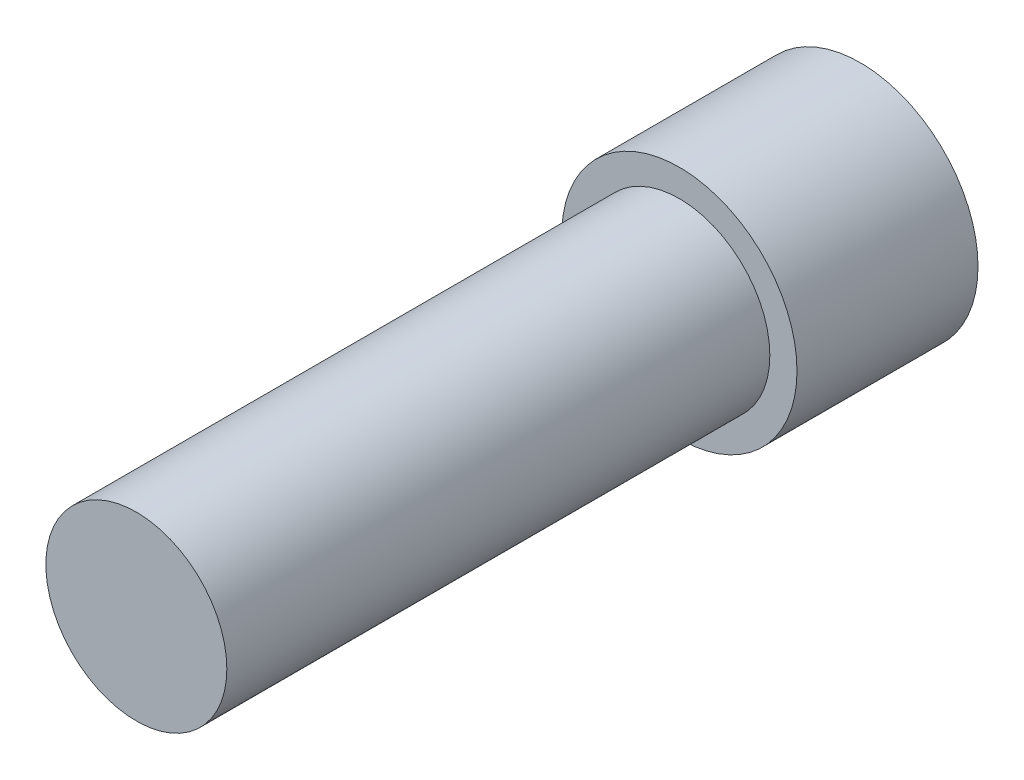
ISO-10303-21;
HEADER;
FILE_DESCRIPTION(('STEP AP214'),'2;1');
FILE_NAME('part.step','',(''),(''),'','','');
FILE_SCHEMA(('AUTOMOTIVE_DESIGN { 1 0 10303 214 1 1 1 1 }'));
ENDSEC;
DATA;
#1=APPLICATION_CONTEXT('core data for automotive mechanical design processes');
#2=APPLICATION_PROTOCOL_DEFINITION('international standard','automotive_design',2000,#1);
#3=PRODUCT_CONTEXT('',#1,'mechanical');
#4=PRODUCT('Part','Part','',(#3));
#5=PRODUCT_RELATED_PRODUCT_CATEGORY('part','',(#4));
#6=PRODUCT_DEFINITION_FORMATION('','',#4);
#7=PRODUCT_DEFINITION_CONTEXT('part definition',#1,'design');
#8=PRODUCT_DEFINITION('design','',#6,#7);
#9=PRODUCT_DEFINITION_SHAPE('','',#8);
#10=(LENGTH_UNIT() NAMED_UNIT(*) SI_UNIT(.MILLI.,.METRE.));
#11=(NAMED_UNIT(*) PLANE_ANGLE_UNIT() SI_UNIT($,.RADIAN.));
#12=(NAMED_UNIT(*) SI_UNIT($,.STERADIAN.) SOLID_ANGLE_UNIT());
#13=UNCERTAINTY_MEASURE_WITH_UNIT(LENGTH_MEASURE(1.E-05),#10,'distance_accuracy_value','');
#14=(GEOMETRIC_REPRESENTATION_CONTEXT(3) GLOBAL_UNCERTAINTY_ASSIGNED_CONTEXT((#13)) GLOBAL_UNIT_ASSIGNED_CONTEXT((#10,
#11,#12)) REPRESENTATION_CONTEXT('',''));
#15=CARTESIAN_POINT('',(0.,0.,0.));
#16=DIRECTION('',(0.,0.,1.));
#17=DIRECTION('',(1.,0.,0.));
#18=AXIS2_PLACEMENT_3D('',#15,#16,#17);
#19=CARTESIAN_POINT('',(0.,0.,10.));
#20=DIRECTION('',(0.,0.,-1.));
#21=DIRECTION('',(-1.,0.,0.));
#22=AXIS2_PLACEMENT_3D('',#19,#20,#21);
#23=CYLINDRICAL_SURFACE('',#22,6.5);
#24=CARTESIAN_POINT('',(0.,0.,10.));
#25=DIRECTION('',(0.,0.,1.));
#26=DIRECTION('',(1.,0.,0.));
#27=AXIS2_PLACEMENT_3D('',#24,#25,#26);
#28=CIRCLE('',#27,6.5);
#29=CARTESIAN_POINT('',(6.5,0.,10.));
#30=VERTEX_POINT('',#29);
#31=EDGE_CURVE('E54',#30,#30,#28,.T.);
#32=ORIENTED_EDGE('',*,*,#31,.F.);
#33=EDGE_LOOP('',(#32));
#34=FACE_BOUND('',#33,.T.);
#35=CARTESIAN_POINT('',(0.,0.,0.));
#36=DIRECTION('',(0.,0.,1.));
#37=DIRECTION('',(1.,0.,0.));
#38=AXIS2_PLACEMENT_3D('',#35,#36,#37);
#39=CIRCLE('',#38,6.5);
#40=CARTESIAN_POINT('',(6.5,0.,0.));
#41=VERTEX_POINT('',#40);
#42=EDGE_CURVE('E48',#41,#41,#39,.T.);
#43=ORIENTED_EDGE('',*,*,#42,.T.);
#44=EDGE_LOOP('',(#43));
#45=FACE_BOUND('',#44,.T.);
#46=ADVANCED_FACE('F45',(#34,#45),#23,.T.);
#47=CARTESIAN_POINT('',(0.,0.,10.));
#48=DIRECTION('',(0.,0.,1.));
#49=DIRECTION('',(1.,0.,0.));
#50=AXIS2_PLACEMENT_3D('',#47,#48,#49);
#51=PLANE('',#50);
#52=CARTESIAN_POINT('',(0.,0.,10.));
#53=DIRECTION('',(0.,0.,1.));
#54=DIRECTION('',(1.,0.,0.));
#55=AXIS2_PLACEMENT_3D('',#52,#53,#54);
#56=CIRCLE('',#55,5.);
#57=CARTESIAN_POINT('',(5.,0.,10.));
#58=VERTEX_POINT('',#57);
#59=EDGE_CURVE('E11',#58,#58,#56,.T.);
#60=ORIENTED_EDGE('',*,*,#59,.F.);
#61=EDGE_LOOP('',(#60));
#62=FACE_BOUND('',#61,.T.);
#63=ORIENTED_EDGE('',*,*,#31,.T.);
#64=EDGE_LOOP('',(#63));
#65=FACE_BOUND('',#64,.T.);
#66=ADVANCED_FACE('F185',(#62,#65),#51,.T.);
#67=CARTESIAN_POINT('',(0.,0.,0.));
#68=DIRECTION('',(0.,0.,1.));
#69=DIRECTION('',(1.,0.,0.));
#70=AXIS2_PLACEMENT_3D('',#67,#68,#69);
#71=PLANE('',#70);
#72=DIRECTION('',(0.866025403784439,0.5,0.));
#73=VECTOR('',#72,1.);
#74=CARTESIAN_POINT('',(-4.5,2.59807621135332,0.));
#75=LINE('',#74,#73);
#76=CARTESIAN_POINT('',(-4.5,2.59807621135332,0.));
#77=VERTEX_POINT('',#76);
#78=CARTESIAN_POINT('',(0.,5.19615242270663,0.));
#79=VERTEX_POINT('',#78);
#80=EDGE_CURVE('E142',#77,#79,#75,.T.);
#81=ORIENTED_EDGE('',*,*,#80,.F.);
#82=DIRECTION('',(0.,1.,0.));
#83=VECTOR('',#82,1.);
#84=CARTESIAN_POINT('',(-4.5,-2.59807621135332,0.));
#85=LINE('',#84,#83);
#86=CARTESIAN_POINT('',(-4.5,-2.59807621135332,0.));
#87=VERTEX_POINT('',#86);
#88=EDGE_CURVE('E62',#87,#77,#85,.T.);
#89=ORIENTED_EDGE('',*,*,#88,.F.);
#90=DIRECTION('',(-0.866025403784439,0.5,0.));
#91=VECTOR('',#90,1.);
#92=CARTESIAN_POINT('',(0.,-5.19615242270663,0.));
#93=LINE('',#92,#91);
#94=CARTESIAN_POINT('',(0.,-5.19615242270663,0.));
#95=VERTEX_POINT('',#94);
#96=EDGE_CURVE('E155',#95,#87,#93,.T.);
#97=ORIENTED_EDGE('',*,*,#96,.F.);
#98=DIRECTION('',(-0.866025403784438,-0.5,0.));
#99=VECTOR('',#98,1.);
#100=CARTESIAN_POINT('',(4.5,-2.59807621135331,0.));
#101=LINE('',#100,#99);
#102=CARTESIAN_POINT('',(4.5,-2.59807621135331,0.));
#103=VERTEX_POINT('',#102);
#104=EDGE_CURVE('E152',#103,#95,#101,.T.);
#105=ORIENTED_EDGE('',*,*,#104,.F.);
#106=DIRECTION('',(0.,-1.,0.));
#107=VECTOR('',#106,1.);
#108=CARTESIAN_POINT('',(4.5,2.59807621135332,0.));
#109=LINE('',#108,#107);
#110=CARTESIAN_POINT('',(4.5,2.59807621135332,0.));
#111=VERTEX_POINT('',#110);
#112=EDGE_CURVE('E110',#111,#103,#109,.T.);
#113=ORIENTED_EDGE('',*,*,#112,.F.);
#114=DIRECTION('',(0.866025403784439,-0.5,0.));
#115=VECTOR('',#114,1.);
#116=CARTESIAN_POINT('',(0.,5.19615242270663,0.));
#117=LINE('',#116,#115);
#118=EDGE_CURVE('E146',#79,#111,#117,.T.);
#119=ORIENTED_EDGE('',*,*,#118,.F.);
#120=EDGE_LOOP('',(#81,#89,#97,#105,#113,#119));
#121=FACE_BOUND('',#120,.T.);
#122=ORIENTED_EDGE('',*,*,#42,.F.);
#123=EDGE_LOOP('',(#122));
#124=FACE_BOUND('',#123,.T.);
#125=ADVANCED_FACE('F182',(#121,#124),#71,.F.);
#126=CARTESIAN_POINT('',(0.,0.,40.));
#127=DIRECTION('',(0.,0.,-1.));
#128=DIRECTION('',(-1.,0.,0.));
#129=AXIS2_PLACEMENT_3D('',#126,#127,#128);
#130=CYLINDRICAL_SURFACE('',#129,5.);
#131=CARTESIAN_POINT('',(0.,0.,40.));
#132=DIRECTION('',(0.,0.,1.));
#133=DIRECTION('',(1.,0.,0.));
#134=AXIS2_PLACEMENT_3D('',#131,#132,#133);
#135=CIRCLE('',#134,5.);
#136=CARTESIAN_POINT('',(5.,0.,40.));
#137=VERTEX_POINT('',#136);
#138=EDGE_CURVE('E161',#137,#137,#135,.T.);
#139=ORIENTED_EDGE('',*,*,#138,.F.);
#140=EDGE_LOOP('',(#139));
#141=FACE_BOUND('',#140,.T.);
#142=ORIENTED_EDGE('',*,*,#59,.T.);
#143=EDGE_LOOP('',(#142));
#144=FACE_BOUND('',#143,.T.);
#145=ADVANCED_FACE('F184',(#141,#144),#130,.T.);
#146=CARTESIAN_POINT('',(0.,0.,40.));
#147=DIRECTION('',(0.,0.,1.));
#148=DIRECTION('',(1.,0.,0.));
#149=AXIS2_PLACEMENT_3D('',#146,#147,#148);
#150=PLANE('',#149);
#151=ORIENTED_EDGE('',*,*,#138,.T.);
#152=EDGE_LOOP('',(#151));
#153=FACE_BOUND('',#152,.T.);
#154=ADVANCED_FACE('F192',(#153),#150,.T.);
#155=CARTESIAN_POINT('',(-4.5,-2.59807621135332,5.));
#156=DIRECTION('',(-1.,0.,0.));
#157=DIRECTION('',(0.,0.,1.));
#158=AXIS2_PLACEMENT_3D('',#155,#156,#157);
#159=PLANE('',#158);
#160=ORIENTED_EDGE('',*,*,#88,.T.);
#161=DIRECTION('',(0.,0.,-1.));
#162=VECTOR('',#161,1.);
#163=CARTESIAN_POINT('',(-4.5,2.59807621135332,5.));
#164=LINE('',#163,#162);
#165=CARTESIAN_POINT('',(-4.5,2.59807621135332,5.));
#166=VERTEX_POINT('',#165);
#167=EDGE_CURVE('E92',#166,#77,#164,.T.);
#168=ORIENTED_EDGE('',*,*,#167,.F.);
#169=DIRECTION('',(0.,1.,0.));
#170=VECTOR('',#169,1.);
#171=CARTESIAN_POINT('',(-4.5,-2.59807621135332,5.));
#172=LINE('',#171,#170);
#173=CARTESIAN_POINT('',(-4.5,-2.59807621135332,5.));
#174=VERTEX_POINT('',#173);
#175=EDGE_CURVE('E158',#174,#166,#172,.T.);
#176=ORIENTED_EDGE('',*,*,#175,.F.);
#177=DIRECTION('',(0.,0.,-1.));
#178=VECTOR('',#177,1.);
#179=CARTESIAN_POINT('',(-4.5,-2.59807621135332,5.));
#180=LINE('',#179,#178);
#181=EDGE_CURVE('E70',#174,#87,#180,.T.);
#182=ORIENTED_EDGE('',*,*,#181,.T.);
#183=EDGE_LOOP('',(#160,#168,#176,#182));
#184=FACE_BOUND('',#183,.T.);
#185=ADVANCED_FACE('F218',(#184),#159,.F.);
#186=CARTESIAN_POINT('',(0.,-5.19615242270663,5.));
#187=DIRECTION('',(-0.5,-0.866025403784439,0.));
#188=DIRECTION('',(0.866025403784439,-0.5,0.));
#189=AXIS2_PLACEMENT_3D('',#186,#187,#188);
#190=PLANE('',#189);
#191=ORIENTED_EDGE('',*,*,#96,.T.);
#192=ORIENTED_EDGE('',*,*,#181,.F.);
#193=DIRECTION('',(-0.866025403784439,0.5,0.));
#194=VECTOR('',#193,1.);
#195=CARTESIAN_POINT('',(0.,-5.19615242270663,5.));
#196=LINE('',#195,#194);
#197=CARTESIAN_POINT('',(0.,-5.19615242270663,5.));
#198=VERTEX_POINT('',#197);
#199=EDGE_CURVE('E124',#198,#174,#196,.T.);
#200=ORIENTED_EDGE('',*,*,#199,.F.);
#201=DIRECTION('',(0.,0.,-1.));
#202=VECTOR('',#201,1.);
#203=CARTESIAN_POINT('',(0.,-5.19615242270663,5.));
#204=LINE('',#203,#202);
#205=EDGE_CURVE('E115',#198,#95,#204,.T.);
#206=ORIENTED_EDGE('',*,*,#205,.T.);
#207=EDGE_LOOP('',(#191,#192,#200,#206));
#208=FACE_BOUND('',#207,.T.);
#209=ADVANCED_FACE('F230',(#208),#190,.F.);
#210=CARTESIAN_POINT('',(4.5,-2.59807621135331,5.));
#211=DIRECTION('',(0.5,-0.866025403784438,0.));
#212=DIRECTION('',(0.866025403784439,0.5,0.));
#213=AXIS2_PLACEMENT_3D('',#210,#211,#212);
#214=PLANE('',#213);
#215=ORIENTED_EDGE('',*,*,#104,.T.);
#216=ORIENTED_EDGE('',*,*,#205,.F.);
#217=DIRECTION('',(-0.866025403784438,-0.5,0.));
#218=VECTOR('',#217,1.);
#219=CARTESIAN_POINT('',(4.5,-2.59807621135331,5.));
#220=LINE('',#219,#218);
#221=CARTESIAN_POINT('',(4.5,-2.59807621135331,5.));
#222=VERTEX_POINT('',#221);
#223=EDGE_CURVE('E119',#222,#198,#220,.T.);
#224=ORIENTED_EDGE('',*,*,#223,.F.);
#225=DIRECTION('',(0.,0.,-1.));
#226=VECTOR('',#225,1.);
#227=CARTESIAN_POINT('',(4.5,-2.59807621135331,5.));
#228=LINE('',#227,#226);
#229=EDGE_CURVE('E103',#222,#103,#228,.T.);
#230=ORIENTED_EDGE('',*,*,#229,.T.);
#231=EDGE_LOOP('',(#215,#216,#224,#230));
#232=FACE_BOUND('',#231,.T.);
#233=ADVANCED_FACE('F120',(#232),#214,.F.);
#234=CARTESIAN_POINT('',(4.5,2.59807621135332,5.));
#235=DIRECTION('',(1.,0.,0.));
#236=DIRECTION('',(0.,0.,-1.));
#237=AXIS2_PLACEMENT_3D('',#234,#235,#236);
#238=PLANE('',#237);
#239=ORIENTED_EDGE('',*,*,#112,.T.);
#240=ORIENTED_EDGE('',*,*,#229,.F.);
#241=DIRECTION('',(0.,-1.,0.));
#242=VECTOR('',#241,1.);
#243=CARTESIAN_POINT('',(4.5,2.59807621135332,5.));
#244=LINE('',#243,#242);
#245=CARTESIAN_POINT('',(4.5,2.59807621135332,5.));
#246=VERTEX_POINT('',#245);
#247=EDGE_CURVE('E107',#246,#222,#244,.T.);
#248=ORIENTED_EDGE('',*,*,#247,.F.);
#249=DIRECTION('',(0.,0.,-1.));
#250=VECTOR('',#249,1.);
#251=CARTESIAN_POINT('',(4.5,2.59807621135332,5.));
#252=LINE('',#251,#250);
#253=EDGE_CURVE('E116',#246,#111,#252,.T.);
#254=ORIENTED_EDGE('',*,*,#253,.T.);
#255=EDGE_LOOP('',(#239,#240,#248,#254));
#256=FACE_BOUND('',#255,.T.);
#257=ADVANCED_FACE('F105',(#256),#238,.F.);
#258=CARTESIAN_POINT('',(0.,5.19615242270663,5.));
#259=DIRECTION('',(0.5,0.866025403784439,0.));
#260=DIRECTION('',(-0.866025403784439,0.5,0.));
#261=AXIS2_PLACEMENT_3D('',#258,#259,#260);
#262=PLANE('',#261);
#263=ORIENTED_EDGE('',*,*,#118,.T.);
#264=ORIENTED_EDGE('',*,*,#253,.F.);
#265=DIRECTION('',(0.866025403784439,-0.5,0.));
#266=VECTOR('',#265,1.);
#267=CARTESIAN_POINT('',(0.,5.19615242270663,5.));
#268=LINE('',#267,#266);
#269=CARTESIAN_POINT('',(0.,5.19615242270663,5.));
#270=VERTEX_POINT('',#269);
#271=EDGE_CURVE('E130',#270,#246,#268,.T.);
#272=ORIENTED_EDGE('',*,*,#271,.F.);
#273=DIRECTION('',(0.,0.,-1.));
#274=VECTOR('',#273,1.);
#275=CARTESIAN_POINT('',(0.,5.19615242270663,5.));
#276=LINE('',#275,#274);
#277=EDGE_CURVE('E166',#270,#79,#276,.T.);
#278=ORIENTED_EDGE('',*,*,#277,.T.);
#279=EDGE_LOOP('',(#263,#264,#272,#278));
#280=FACE_BOUND('',#279,.T.);
#281=ADVANCED_FACE('F255',(#280),#262,.F.);
#282=CARTESIAN_POINT('',(-4.5,2.59807621135332,5.));
#283=DIRECTION('',(-0.5,0.866025403784439,0.));
#284=DIRECTION('',(-0.866025403784439,-0.5,0.));
#285=AXIS2_PLACEMENT_3D('',#282,#283,#284);
#286=PLANE('',#285);
#287=ORIENTED_EDGE('',*,*,#80,.T.);
#288=ORIENTED_EDGE('',*,*,#277,.F.);
#289=DIRECTION('',(0.866025403784439,0.5,0.));
#290=VECTOR('',#289,1.);
#291=CARTESIAN_POINT('',(-4.5,2.59807621135332,5.));
#292=LINE('',#291,#290);
#293=EDGE_CURVE('E134',#166,#270,#292,.T.);
#294=ORIENTED_EDGE('',*,*,#293,.F.);
#295=ORIENTED_EDGE('',*,*,#167,.T.);
#296=EDGE_LOOP('',(#287,#288,#294,#295));
#297=FACE_BOUND('',#296,.T.);
#298=ADVANCED_FACE('F264',(#297),#286,.F.);
#299=CARTESIAN_POINT('',(0.,0.,5.));
#300=DIRECTION('',(0.,0.,-1.));
#301=DIRECTION('',(-1.,0.,0.));
#302=AXIS2_PLACEMENT_3D('',#299,#300,#301);
#303=PLANE('',#302);
#304=ORIENTED_EDGE('',*,*,#175,.T.);
#305=ORIENTED_EDGE('',*,*,#293,.T.);
#306=ORIENTED_EDGE('',*,*,#271,.T.);
#307=ORIENTED_EDGE('',*,*,#247,.T.);
#308=ORIENTED_EDGE('',*,*,#223,.T.);
#309=ORIENTED_EDGE('',*,*,#199,.T.);
#310=EDGE_LOOP('',(#304,#305,#306,#307,#308,#309));
#311=FACE_BOUND('',#310,.T.);
#312=ADVANCED_FACE('F127',(#311),#303,.T.);
#313=CLOSED_SHELL('',(#46,#66,#125,#145,#154,#185,#209,#233,#257,#281,#298,#312));
#314=MANIFOLD_SOLID_BREP('B2',#313);
#315=ADVANCED_BREP_SHAPE_REPRESENTATION('',(#18,#314),#14);
#316=SHAPE_DEFINITION_REPRESENTATION(#9,#315);
ENDSEC;
END-ISO-10303-21;
